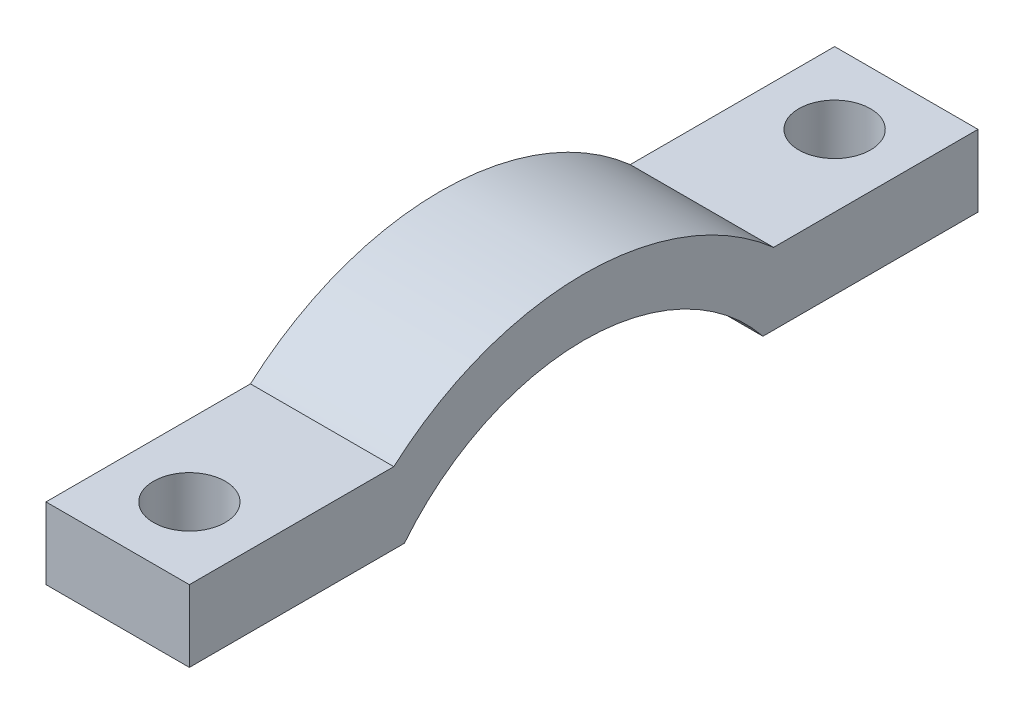
ISO-10303-21;
HEADER;
FILE_DESCRIPTION(('STEP AP214'),'2;1');
FILE_NAME('part.step','',(''),(''),'','','');
FILE_SCHEMA(('AUTOMOTIVE_DESIGN { 1 0 10303 214 1 1 1 1 }'));
ENDSEC;
DATA;
#1=APPLICATION_CONTEXT('core data for automotive mechanical design processes');
#2=APPLICATION_PROTOCOL_DEFINITION('international standard','automotive_design',2000,#1);
#3=PRODUCT_CONTEXT('',#1,'mechanical');
#4=PRODUCT('Part','Part','',(#3));
#5=PRODUCT_RELATED_PRODUCT_CATEGORY('part','',(#4));
#6=PRODUCT_DEFINITION_FORMATION('','',#4);
#7=PRODUCT_DEFINITION_CONTEXT('part definition',#1,'design');
#8=PRODUCT_DEFINITION('design','',#6,#7);
#9=PRODUCT_DEFINITION_SHAPE('','',#8);
#10=(LENGTH_UNIT() NAMED_UNIT(*) SI_UNIT(.MILLI.,.METRE.));
#11=(NAMED_UNIT(*) PLANE_ANGLE_UNIT() SI_UNIT($,.RADIAN.));
#12=(NAMED_UNIT(*) SI_UNIT($,.STERADIAN.) SOLID_ANGLE_UNIT());
#13=UNCERTAINTY_MEASURE_WITH_UNIT(LENGTH_MEASURE(1.E-05),#10,'distance_accuracy_value','');
#14=(GEOMETRIC_REPRESENTATION_CONTEXT(3) GLOBAL_UNCERTAINTY_ASSIGNED_CONTEXT((#13)) GLOBAL_UNIT_ASSIGNED_CONTEXT((#10,
#11,#12)) REPRESENTATION_CONTEXT('',''));
#15=CARTESIAN_POINT('',(0.,0.,0.));
#16=DIRECTION('',(0.,0.,1.));
#17=DIRECTION('',(1.,0.,0.));
#18=AXIS2_PLACEMENT_3D('',#15,#16,#17);
#19=CARTESIAN_POINT('',(10.,15.,0.));
#20=DIRECTION('',(0.,-1.,0.));
#21=DIRECTION('',(0.,0.,-1.));
#22=AXIS2_PLACEMENT_3D('',#19,#20,#21);
#23=PLANE('',#22);
#24=CARTESIAN_POINT('',(5.,15.,-22.5028036855739));
#25=DIRECTION('',(0.,-1.,0.));
#26=DIRECTION('',(0.,0.,-1.));
#27=AXIS2_PLACEMENT_3D('',#24,#25,#26);
#28=CIRCLE('',#27,2.5);
#29=CARTESIAN_POINT('',(5.,15.,-25.0028036855739));
#30=VERTEX_POINT('',#29);
#31=EDGE_CURVE('E186',#30,#30,#28,.T.);
#32=ORIENTED_EDGE('',*,*,#31,.T.);
#33=EDGE_LOOP('',(#32));
#34=FACE_BOUND('',#33,.T.);
#35=DIRECTION('',(0.,0.,1.));
#36=VECTOR('',#35,1.);
#37=CARTESIAN_POINT('',(0.,15.,0.));
#38=LINE('',#37,#36);
#39=CARTESIAN_POINT('',(0.,15.,-27.5028036855739));
#40=VERTEX_POINT('',#39);
#41=CARTESIAN_POINT('',(0.,15.,-13.2438702802466));
#42=VERTEX_POINT('',#41);
#43=EDGE_CURVE('E134',#40,#42,#38,.T.);
#44=ORIENTED_EDGE('',*,*,#43,.T.);
#45=DIRECTION('',(-1.,0.,0.));
#46=VECTOR('',#45,1.);
#47=CARTESIAN_POINT('',(10.,15.,-13.2438702802466));
#48=LINE('',#47,#46);
#49=CARTESIAN_POINT('',(10.,15.,-13.2438702802466));
#50=VERTEX_POINT('',#49);
#51=EDGE_CURVE('E11',#50,#42,#48,.T.);
#52=ORIENTED_EDGE('',*,*,#51,.F.);
#53=DIRECTION('',(0.,0.,1.));
#54=VECTOR('',#53,1.);
#55=CARTESIAN_POINT('',(10.,15.,0.));
#56=LINE('',#55,#54);
#57=CARTESIAN_POINT('',(10.,15.,-27.5028036855739));
#58=VERTEX_POINT('',#57);
#59=EDGE_CURVE('E155',#58,#50,#56,.T.);
#60=ORIENTED_EDGE('',*,*,#59,.F.);
#61=DIRECTION('',(-1.,0.,0.));
#62=VECTOR('',#61,1.);
#63=CARTESIAN_POINT('',(10.,15.,-27.5028036855739));
#64=LINE('',#63,#62);
#65=EDGE_CURVE('E51',#58,#40,#64,.T.);
#66=ORIENTED_EDGE('',*,*,#65,.T.);
#67=EDGE_LOOP('',(#44,#52,#60,#66));
#68=FACE_BOUND('',#67,.T.);
#69=ADVANCED_FACE('F35',(#34,#68),#23,.F.);
#70=CARTESIAN_POINT('',(10.,0.,0.));
#71=DIRECTION('',(-1.,0.,0.));
#72=DIRECTION('',(0.,0.,1.));
#73=AXIS2_PLACEMENT_3D('',#70,#71,#72);
#74=CYLINDRICAL_SURFACE('',#73,20.01);
#75=CARTESIAN_POINT('',(0.,0.,0.));
#76=DIRECTION('',(1.,0.,0.));
#77=DIRECTION('',(0.,0.,-1.));
#78=AXIS2_PLACEMENT_3D('',#75,#76,#77);
#79=CIRCLE('',#78,20.01);
#80=CARTESIAN_POINT('',(0.,15.,13.2438702802466));
#81=VERTEX_POINT('',#80);
#82=EDGE_CURVE('E136',#42,#81,#79,.T.);
#83=ORIENTED_EDGE('',*,*,#82,.T.);
#84=DIRECTION('',(-1.,0.,0.));
#85=VECTOR('',#84,1.);
#86=CARTESIAN_POINT('',(10.,15.,13.2438702802466));
#87=LINE('',#86,#85);
#88=CARTESIAN_POINT('',(10.,15.,13.2438702802466));
#89=VERTEX_POINT('',#88);
#90=EDGE_CURVE('E43',#89,#81,#87,.T.);
#91=ORIENTED_EDGE('',*,*,#90,.F.);
#92=CARTESIAN_POINT('',(10.,0.,0.));
#93=DIRECTION('',(1.,0.,0.));
#94=DIRECTION('',(0.,0.,-1.));
#95=AXIS2_PLACEMENT_3D('',#92,#93,#94);
#96=CIRCLE('',#95,20.01);
#97=EDGE_CURVE('E90',#50,#89,#96,.T.);
#98=ORIENTED_EDGE('',*,*,#97,.F.);
#99=ORIENTED_EDGE('',*,*,#51,.T.);
#100=EDGE_LOOP('',(#83,#91,#98,#99));
#101=FACE_BOUND('',#100,.T.);
#102=ADVANCED_FACE('F168',(#101),#74,.T.);
#103=CARTESIAN_POINT('',(10.,15.,0.));
#104=DIRECTION('',(0.,1.,0.));
#105=DIRECTION('',(0.,0.,1.));
#106=AXIS2_PLACEMENT_3D('',#103,#104,#105);
#107=PLANE('',#106);
#108=CARTESIAN_POINT('',(5.,15.,22.5028036855739));
#109=DIRECTION('',(0.,1.,0.));
#110=DIRECTION('',(0.,0.,1.));
#111=AXIS2_PLACEMENT_3D('',#108,#109,#110);
#112=CIRCLE('',#111,2.5);
#113=CARTESIAN_POINT('',(5.,15.,25.0028036855739));
#114=VERTEX_POINT('',#113);
#115=EDGE_CURVE('E137',#114,#114,#112,.T.);
#116=ORIENTED_EDGE('',*,*,#115,.F.);
#117=EDGE_LOOP('',(#116));
#118=FACE_BOUND('',#117,.T.);
#119=DIRECTION('',(0.,0.,-1.));
#120=VECTOR('',#119,1.);
#121=CARTESIAN_POINT('',(0.,15.,0.));
#122=LINE('',#121,#120);
#123=CARTESIAN_POINT('',(0.,15.,27.5028036855739));
#124=VERTEX_POINT('',#123);
#125=EDGE_CURVE('E140',#124,#81,#122,.T.);
#126=ORIENTED_EDGE('',*,*,#125,.F.);
#127=DIRECTION('',(-1.,0.,0.));
#128=VECTOR('',#127,1.);
#129=CARTESIAN_POINT('',(10.,15.,27.5028036855739));
#130=LINE('',#129,#128);
#131=CARTESIAN_POINT('',(10.,15.,27.5028036855739));
#132=VERTEX_POINT('',#131);
#133=EDGE_CURVE('E161',#132,#124,#130,.T.);
#134=ORIENTED_EDGE('',*,*,#133,.F.);
#135=DIRECTION('',(0.,0.,-1.));
#136=VECTOR('',#135,1.);
#137=CARTESIAN_POINT('',(10.,15.,0.));
#138=LINE('',#137,#136);
#139=EDGE_CURVE('E167',#132,#89,#138,.T.);
#140=ORIENTED_EDGE('',*,*,#139,.T.);
#141=ORIENTED_EDGE('',*,*,#90,.T.);
#142=EDGE_LOOP('',(#126,#134,#140,#141));
#143=FACE_BOUND('',#142,.T.);
#144=ADVANCED_FACE('F165',(#118,#143),#107,.T.);
#145=CARTESIAN_POINT('',(10.,0.,27.5028036855739));
#146=DIRECTION('',(0.,0.,1.));
#147=DIRECTION('',(1.,0.,0.));
#148=AXIS2_PLACEMENT_3D('',#145,#146,#147);
#149=PLANE('',#148);
#150=DIRECTION('',(0.,1.,0.));
#151=VECTOR('',#150,1.);
#152=CARTESIAN_POINT('',(0.,0.,27.5028036855739));
#153=LINE('',#152,#151);
#154=CARTESIAN_POINT('',(0.,10.,27.5028036855739));
#155=VERTEX_POINT('',#154);
#156=EDGE_CURVE('E143',#155,#124,#153,.T.);
#157=ORIENTED_EDGE('',*,*,#156,.F.);
#158=DIRECTION('',(-1.,0.,0.));
#159=VECTOR('',#158,1.);
#160=CARTESIAN_POINT('',(10.,10.,27.5028036855739));
#161=LINE('',#160,#159);
#162=CARTESIAN_POINT('',(10.,10.,27.5028036855739));
#163=VERTEX_POINT('',#162);
#164=EDGE_CURVE('E159',#163,#155,#161,.T.);
#165=ORIENTED_EDGE('',*,*,#164,.F.);
#166=DIRECTION('',(0.,1.,0.));
#167=VECTOR('',#166,1.);
#168=CARTESIAN_POINT('',(10.,0.,27.5028036855739));
#169=LINE('',#168,#167);
#170=EDGE_CURVE('E129',#163,#132,#169,.T.);
#171=ORIENTED_EDGE('',*,*,#170,.T.);
#172=ORIENTED_EDGE('',*,*,#133,.T.);
#173=EDGE_LOOP('',(#157,#165,#171,#172));
#174=FACE_BOUND('',#173,.T.);
#175=ADVANCED_FACE('F175',(#174),#149,.T.);
#176=CARTESIAN_POINT('',(10.,10.,0.));
#177=DIRECTION('',(0.,-1.,0.));
#178=DIRECTION('',(0.,0.,-1.));
#179=AXIS2_PLACEMENT_3D('',#176,#177,#178);
#180=PLANE('',#179);
#181=CARTESIAN_POINT('',(5.,10.,22.5028036855739));
#182=DIRECTION('',(0.,-1.,0.));
#183=DIRECTION('',(0.,0.,-1.));
#184=AXIS2_PLACEMENT_3D('',#181,#182,#183);
#185=CIRCLE('',#184,2.5);
#186=CARTESIAN_POINT('',(5.,10.,20.0028036855739));
#187=VERTEX_POINT('',#186);
#188=EDGE_CURVE('E183',#187,#187,#185,.T.);
#189=ORIENTED_EDGE('',*,*,#188,.F.);
#190=EDGE_LOOP('',(#189));
#191=FACE_BOUND('',#190,.T.);
#192=DIRECTION('',(0.,0.,1.));
#193=VECTOR('',#192,1.);
#194=CARTESIAN_POINT('',(0.,10.,0.));
#195=LINE('',#194,#193);
#196=CARTESIAN_POINT('',(0.,10.,12.5028036855739));
#197=VERTEX_POINT('',#196);
#198=EDGE_CURVE('E146',#197,#155,#195,.T.);
#199=ORIENTED_EDGE('',*,*,#198,.F.);
#200=DIRECTION('',(-1.,0.,0.));
#201=VECTOR('',#200,1.);
#202=CARTESIAN_POINT('',(10.,10.,12.5028036855739));
#203=LINE('',#202,#201);
#204=CARTESIAN_POINT('',(10.,10.,12.5028036855739));
#205=VERTEX_POINT('',#204);
#206=EDGE_CURVE('E115',#205,#197,#203,.T.);
#207=ORIENTED_EDGE('',*,*,#206,.F.);
#208=DIRECTION('',(0.,0.,1.));
#209=VECTOR('',#208,1.);
#210=CARTESIAN_POINT('',(10.,10.,0.));
#211=LINE('',#210,#209);
#212=EDGE_CURVE('E127',#205,#163,#211,.T.);
#213=ORIENTED_EDGE('',*,*,#212,.T.);
#214=ORIENTED_EDGE('',*,*,#164,.T.);
#215=EDGE_LOOP('',(#199,#207,#213,#214));
#216=FACE_BOUND('',#215,.T.);
#217=ADVANCED_FACE('F204',(#191,#216),#180,.T.);
#218=CARTESIAN_POINT('',(10.,0.,0.));
#219=DIRECTION('',(-1.,0.,0.));
#220=DIRECTION('',(0.,0.,1.));
#221=AXIS2_PLACEMENT_3D('',#218,#219,#220);
#222=CYLINDRICAL_SURFACE('',#221,16.01);
#223=CARTESIAN_POINT('',(0.,0.,0.));
#224=DIRECTION('',(1.,0.,0.));
#225=DIRECTION('',(0.,0.,-1.));
#226=AXIS2_PLACEMENT_3D('',#223,#224,#225);
#227=CIRCLE('',#226,16.01);
#228=CARTESIAN_POINT('',(0.,10.,-12.5028036855739));
#229=VERTEX_POINT('',#228);
#230=EDGE_CURVE('E112',#229,#197,#227,.T.);
#231=ORIENTED_EDGE('',*,*,#230,.F.);
#232=DIRECTION('',(-1.,0.,0.));
#233=VECTOR('',#232,1.);
#234=CARTESIAN_POINT('',(10.,10.,-12.5028036855739));
#235=LINE('',#234,#233);
#236=CARTESIAN_POINT('',(10.,10.,-12.5028036855739));
#237=VERTEX_POINT('',#236);
#238=EDGE_CURVE('E106',#237,#229,#235,.T.);
#239=ORIENTED_EDGE('',*,*,#238,.F.);
#240=CARTESIAN_POINT('',(10.,0.,0.));
#241=DIRECTION('',(1.,0.,0.));
#242=DIRECTION('',(0.,0.,-1.));
#243=AXIS2_PLACEMENT_3D('',#240,#241,#242);
#244=CIRCLE('',#243,16.01);
#245=EDGE_CURVE('E110',#237,#205,#244,.T.);
#246=ORIENTED_EDGE('',*,*,#245,.T.);
#247=ORIENTED_EDGE('',*,*,#206,.T.);
#248=EDGE_LOOP('',(#231,#239,#246,#247));
#249=FACE_BOUND('',#248,.T.);
#250=ADVANCED_FACE('F108',(#249),#222,.F.);
#251=CARTESIAN_POINT('',(10.,10.,0.));
#252=DIRECTION('',(0.,1.,0.));
#253=DIRECTION('',(0.,0.,1.));
#254=AXIS2_PLACEMENT_3D('',#251,#252,#253);
#255=PLANE('',#254);
#256=CARTESIAN_POINT('',(5.,10.,-22.5028036855739));
#257=DIRECTION('',(0.,-1.,0.));
#258=DIRECTION('',(0.,0.,1.));
#259=AXIS2_PLACEMENT_3D('',#256,#257,#258);
#260=CIRCLE('',#259,2.5);
#261=CARTESIAN_POINT('',(5.,10.,-20.0028036855739));
#262=VERTEX_POINT('',#261);
#263=EDGE_CURVE('E189',#262,#262,#260,.T.);
#264=ORIENTED_EDGE('',*,*,#263,.F.);
#265=EDGE_LOOP('',(#264));
#266=FACE_BOUND('',#265,.T.);
#267=DIRECTION('',(0.,0.,-1.));
#268=VECTOR('',#267,1.);
#269=CARTESIAN_POINT('',(0.,10.,0.));
#270=LINE('',#269,#268);
#271=CARTESIAN_POINT('',(0.,10.,-27.5028036855739));
#272=VERTEX_POINT('',#271);
#273=EDGE_CURVE('E150',#229,#272,#270,.T.);
#274=ORIENTED_EDGE('',*,*,#273,.T.);
#275=DIRECTION('',(-1.,0.,0.));
#276=VECTOR('',#275,1.);
#277=CARTESIAN_POINT('',(10.,10.,-27.5028036855739));
#278=LINE('',#277,#276);
#279=CARTESIAN_POINT('',(10.,10.,-27.5028036855739));
#280=VERTEX_POINT('',#279);
#281=EDGE_CURVE('E78',#280,#272,#278,.T.);
#282=ORIENTED_EDGE('',*,*,#281,.F.);
#283=DIRECTION('',(0.,0.,-1.));
#284=VECTOR('',#283,1.);
#285=CARTESIAN_POINT('',(10.,10.,0.));
#286=LINE('',#285,#284);
#287=EDGE_CURVE('E117',#237,#280,#286,.T.);
#288=ORIENTED_EDGE('',*,*,#287,.F.);
#289=ORIENTED_EDGE('',*,*,#238,.T.);
#290=EDGE_LOOP('',(#274,#282,#288,#289));
#291=FACE_BOUND('',#290,.T.);
#292=ADVANCED_FACE('F118',(#266,#291),#255,.F.);
#293=CARTESIAN_POINT('',(10.,0.,-27.5028036855739));
#294=DIRECTION('',(0.,0.,-1.));
#295=DIRECTION('',(-1.,0.,0.));
#296=AXIS2_PLACEMENT_3D('',#293,#294,#295);
#297=PLANE('',#296);
#298=DIRECTION('',(0.,-1.,0.));
#299=VECTOR('',#298,1.);
#300=CARTESIAN_POINT('',(0.,0.,-27.5028036855739));
#301=LINE('',#300,#299);
#302=EDGE_CURVE('E152',#40,#272,#301,.T.);
#303=ORIENTED_EDGE('',*,*,#302,.F.);
#304=ORIENTED_EDGE('',*,*,#65,.F.);
#305=DIRECTION('',(0.,-1.,0.));
#306=VECTOR('',#305,1.);
#307=CARTESIAN_POINT('',(10.,0.,-27.5028036855739));
#308=LINE('',#307,#306);
#309=EDGE_CURVE('E121',#58,#280,#308,.T.);
#310=ORIENTED_EDGE('',*,*,#309,.T.);
#311=ORIENTED_EDGE('',*,*,#281,.T.);
#312=EDGE_LOOP('',(#303,#304,#310,#311));
#313=FACE_BOUND('',#312,.T.);
#314=ADVANCED_FACE('F197',(#313),#297,.T.);
#315=CARTESIAN_POINT('',(10.,0.,0.));
#316=DIRECTION('',(1.,0.,0.));
#317=DIRECTION('',(0.,0.,-1.));
#318=AXIS2_PLACEMENT_3D('',#315,#316,#317);
#319=PLANE('',#318);
#320=ORIENTED_EDGE('',*,*,#59,.T.);
#321=ORIENTED_EDGE('',*,*,#97,.T.);
#322=ORIENTED_EDGE('',*,*,#139,.F.);
#323=ORIENTED_EDGE('',*,*,#170,.F.);
#324=ORIENTED_EDGE('',*,*,#212,.F.);
#325=ORIENTED_EDGE('',*,*,#245,.F.);
#326=ORIENTED_EDGE('',*,*,#287,.T.);
#327=ORIENTED_EDGE('',*,*,#309,.F.);
#328=EDGE_LOOP('',(#320,#321,#322,#323,#324,#325,#326,#327));
#329=FACE_BOUND('',#328,.T.);
#330=ADVANCED_FACE('F124',(#329),#319,.T.);
#331=CARTESIAN_POINT('',(0.,0.,0.));
#332=DIRECTION('',(1.,0.,0.));
#333=DIRECTION('',(0.,0.,-1.));
#334=AXIS2_PLACEMENT_3D('',#331,#332,#333);
#335=PLANE('',#334);
#336=ORIENTED_EDGE('',*,*,#43,.F.);
#337=ORIENTED_EDGE('',*,*,#302,.T.);
#338=ORIENTED_EDGE('',*,*,#273,.F.);
#339=ORIENTED_EDGE('',*,*,#230,.T.);
#340=ORIENTED_EDGE('',*,*,#198,.T.);
#341=ORIENTED_EDGE('',*,*,#156,.T.);
#342=ORIENTED_EDGE('',*,*,#125,.T.);
#343=ORIENTED_EDGE('',*,*,#82,.F.);
#344=EDGE_LOOP('',(#336,#337,#338,#339,#340,#341,#342,#343));
#345=FACE_BOUND('',#344,.T.);
#346=ADVANCED_FACE('F171',(#345),#335,.F.);
#347=CARTESIAN_POINT('',(5.,20.01,22.5028036855739));
#348=DIRECTION('',(0.,-1.,0.));
#349=DIRECTION('',(0.,0.,-1.));
#350=AXIS2_PLACEMENT_3D('',#347,#348,#349);
#351=CYLINDRICAL_SURFACE('',#350,2.5);
#352=ORIENTED_EDGE('',*,*,#115,.T.);
#353=EDGE_LOOP('',(#352));
#354=FACE_BOUND('',#353,.T.);
#355=ORIENTED_EDGE('',*,*,#188,.T.);
#356=EDGE_LOOP('',(#355));
#357=FACE_BOUND('',#356,.T.);
#358=ADVANCED_FACE('F213',(#354,#357),#351,.F.);
#359=CARTESIAN_POINT('',(5.,20.01,-22.5028036855739));
#360=DIRECTION('',(0.,-1.,0.));
#361=DIRECTION('',(0.,0.,-1.));
#362=AXIS2_PLACEMENT_3D('',#359,#360,#361);
#363=CYLINDRICAL_SURFACE('',#362,2.5);
#364=ORIENTED_EDGE('',*,*,#263,.T.);
#365=EDGE_LOOP('',(#364));
#366=FACE_BOUND('',#365,.T.);
#367=ORIENTED_EDGE('',*,*,#31,.F.);
#368=EDGE_LOOP('',(#367));
#369=FACE_BOUND('',#368,.T.);
#370=ADVANCED_FACE('F193',(#366,#369),#363,.F.);
#371=CLOSED_SHELL('',(#69,#102,#144,#175,#217,#250,#292,#314,#330,#346,#358,#370));
#372=MANIFOLD_SOLID_BREP('B2',#371);
#373=ADVANCED_BREP_SHAPE_REPRESENTATION('',(#18,#372),#14);
#374=SHAPE_DEFINITION_REPRESENTATION(#9,#373);
ENDSEC;
END-ISO-10303-21;
